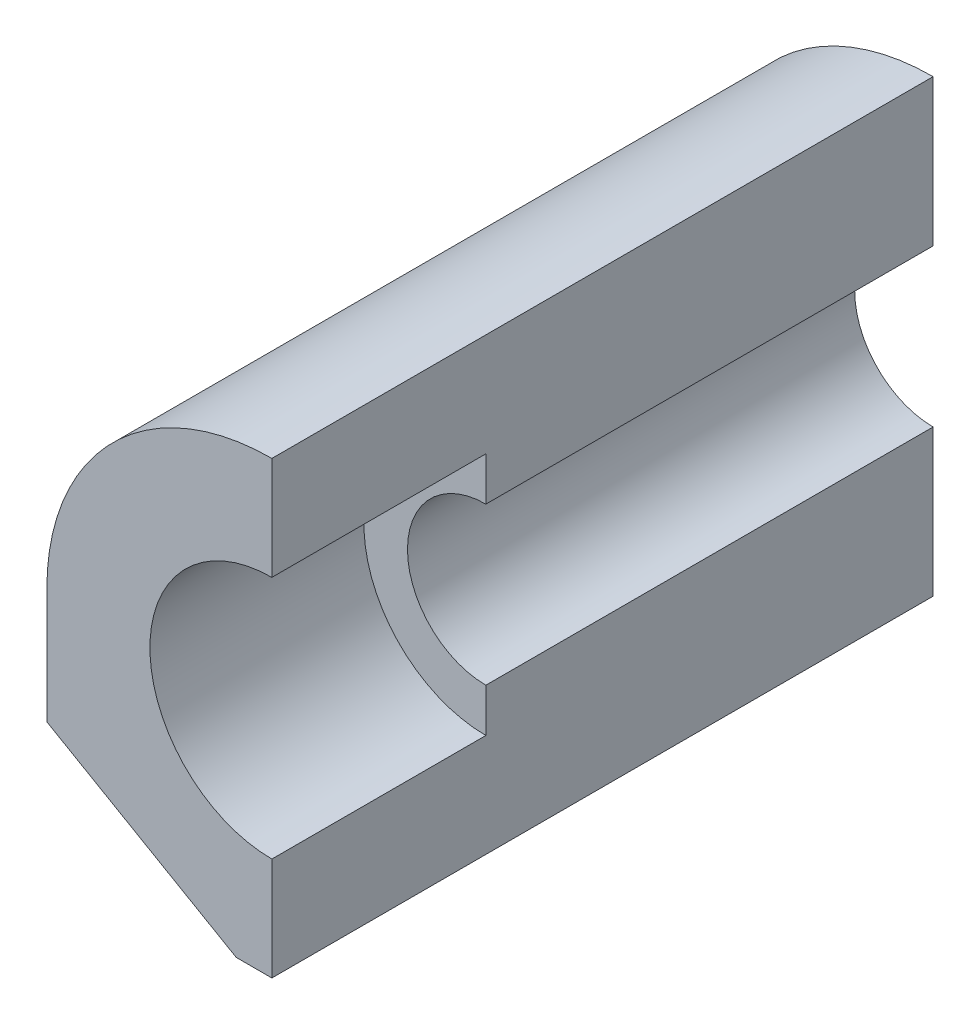
ISO-10303-21;
HEADER;
FILE_DESCRIPTION(('STEP AP214'),'2;1');
FILE_NAME('part.step','',(''),(''),'','','');
FILE_SCHEMA(('AUTOMOTIVE_DESIGN { 1 0 10303 214 1 1 1 1 }'));
ENDSEC;
DATA;
#1=APPLICATION_CONTEXT('core data for automotive mechanical design processes');
#2=APPLICATION_PROTOCOL_DEFINITION('international standard','automotive_design',2000,#1);
#3=PRODUCT_CONTEXT('',#1,'mechanical');
#4=PRODUCT('Part','Part','',(#3));
#5=PRODUCT_RELATED_PRODUCT_CATEGORY('part','',(#4));
#6=PRODUCT_DEFINITION_FORMATION('','',#4);
#7=PRODUCT_DEFINITION_CONTEXT('part definition',#1,'design');
#8=PRODUCT_DEFINITION('design','',#6,#7);
#9=PRODUCT_DEFINITION_SHAPE('','',#8);
#10=(LENGTH_UNIT() NAMED_UNIT(*) SI_UNIT(.MILLI.,.METRE.));
#11=(NAMED_UNIT(*) PLANE_ANGLE_UNIT() SI_UNIT($,.RADIAN.));
#12=(NAMED_UNIT(*) SI_UNIT($,.STERADIAN.) SOLID_ANGLE_UNIT());
#13=UNCERTAINTY_MEASURE_WITH_UNIT(LENGTH_MEASURE(1.E-05),#10,'distance_accuracy_value','');
#14=(GEOMETRIC_REPRESENTATION_CONTEXT(3) GLOBAL_UNCERTAINTY_ASSIGNED_CONTEXT((#13)) GLOBAL_UNIT_ASSIGNED_CONTEXT((#10,
#11,#12)) REPRESENTATION_CONTEXT('',''));
#15=CARTESIAN_POINT('',(0.,0.,0.));
#16=DIRECTION('',(0.,0.,1.));
#17=DIRECTION('',(1.,0.,0.));
#18=AXIS2_PLACEMENT_3D('',#15,#16,#17);
#19=CARTESIAN_POINT('',(0.,0.,-241.));
#20=DIRECTION('',(0.,0.,1.));
#21=DIRECTION('',(1.,0.,0.));
#22=AXIS2_PLACEMENT_3D('',#19,#20,#21);
#23=CYLINDRICAL_SURFACE('',#22,28.575);
#24=DIRECTION('',(0.,0.,1.));
#25=VECTOR('',#24,1.);
#26=CARTESIAN_POINT('',(0.,28.575,-241.));
#27=LINE('',#26,#25);
#28=CARTESIAN_POINT('',(0.,28.575,-241.));
#29=VERTEX_POINT('',#28);
#30=CARTESIAN_POINT('',(0.,28.575,-78.));
#31=VERTEX_POINT('',#30);
#32=EDGE_CURVE('E44',#29,#31,#27,.T.);
#33=ORIENTED_EDGE('',*,*,#32,.T.);
#34=CARTESIAN_POINT('',(0.,0.,-78.));
#35=DIRECTION('',(0.,0.,1.));
#36=DIRECTION('',(1.,0.,0.));
#37=AXIS2_PLACEMENT_3D('',#34,#35,#36);
#38=CIRCLE('',#37,28.575);
#39=CARTESIAN_POINT('',(0.,-28.575,-78.));
#40=VERTEX_POINT('',#39);
#41=EDGE_CURVE('E165',#31,#40,#38,.T.);
#42=ORIENTED_EDGE('',*,*,#41,.T.);
#43=DIRECTION('',(0.,0.,1.));
#44=VECTOR('',#43,1.);
#45=CARTESIAN_POINT('',(0.,-28.575,-241.));
#46=LINE('',#45,#44);
#47=CARTESIAN_POINT('',(0.,-28.575,-241.));
#48=VERTEX_POINT('',#47);
#49=EDGE_CURVE('E11',#48,#40,#46,.T.);
#50=ORIENTED_EDGE('',*,*,#49,.F.);
#51=CARTESIAN_POINT('',(0.,0.,-241.));
#52=DIRECTION('',(0.,0.,-1.));
#53=DIRECTION('',(1.,0.,0.));
#54=AXIS2_PLACEMENT_3D('',#51,#52,#53);
#55=CIRCLE('',#54,28.575);
#56=EDGE_CURVE('E153',#48,#29,#55,.T.);
#57=ORIENTED_EDGE('',*,*,#56,.T.);
#58=EDGE_LOOP('',(#33,#42,#50,#57));
#59=FACE_BOUND('',#58,.T.);
#60=ADVANCED_FACE('F41',(#59),#23,.F.);
#61=CARTESIAN_POINT('',(0.,-28.575,-241.));
#62=DIRECTION('',(1.,0.,0.));
#63=DIRECTION('',(0.,1.,0.));
#64=AXIS2_PLACEMENT_3D('',#61,#62,#63);
#65=PLANE('',#64);
#66=DIRECTION('',(0.,0.,1.));
#67=VECTOR('',#66,1.);
#68=CARTESIAN_POINT('',(0.,-44.45,-78.));
#69=LINE('',#68,#67);
#70=CARTESIAN_POINT('',(0.,-44.45,-78.));
#71=VERTEX_POINT('',#70);
#72=CARTESIAN_POINT('',(0.,-44.45,0.));
#73=VERTEX_POINT('',#72);
#74=EDGE_CURVE('E142',#71,#73,#69,.T.);
#75=ORIENTED_EDGE('',*,*,#74,.T.);
#76=DIRECTION('',(0.,1.,0.));
#77=VECTOR('',#76,1.);
#78=CARTESIAN_POINT('',(0.,-28.575,0.));
#79=LINE('',#78,#77);
#80=CARTESIAN_POINT('',(0.,-82.,0.));
#81=VERTEX_POINT('',#80);
#82=EDGE_CURVE('E151',#81,#73,#79,.T.);
#83=ORIENTED_EDGE('',*,*,#82,.F.);
#84=DIRECTION('',(0.,0.,1.));
#85=VECTOR('',#84,1.);
#86=CARTESIAN_POINT('',(0.,-82.,-241.));
#87=LINE('',#86,#85);
#88=CARTESIAN_POINT('',(0.,-82.,-241.));
#89=VERTEX_POINT('',#88);
#90=EDGE_CURVE('E49',#89,#81,#87,.T.);
#91=ORIENTED_EDGE('',*,*,#90,.F.);
#92=DIRECTION('',(0.,1.,0.));
#93=VECTOR('',#92,1.);
#94=CARTESIAN_POINT('',(0.,-28.575,-241.));
#95=LINE('',#94,#93);
#96=EDGE_CURVE('E129',#89,#48,#95,.T.);
#97=ORIENTED_EDGE('',*,*,#96,.T.);
#98=ORIENTED_EDGE('',*,*,#49,.T.);
#99=DIRECTION('',(0.,-1.,0.));
#100=VECTOR('',#99,1.);
#101=CARTESIAN_POINT('',(0.,-28.575,-78.));
#102=LINE('',#101,#100);
#103=EDGE_CURVE('E183',#40,#71,#102,.T.);
#104=ORIENTED_EDGE('',*,*,#103,.T.);
#105=EDGE_LOOP('',(#75,#83,#91,#97,#98,#104));
#106=FACE_BOUND('',#105,.T.);
#107=ADVANCED_FACE('F203',(#106),#65,.T.);
#108=CARTESIAN_POINT('',(0.,-82.,-241.));
#109=DIRECTION('',(0.,-1.,0.));
#110=DIRECTION('',(0.,0.,-1.));
#111=AXIS2_PLACEMENT_3D('',#108,#109,#110);
#112=PLANE('',#111);
#113=DIRECTION('',(1.,0.,0.));
#114=VECTOR('',#113,1.);
#115=CARTESIAN_POINT('',(0.,-82.,0.));
#116=LINE('',#115,#114);
#117=CARTESIAN_POINT('',(-13.,-82.,0.));
#118=VERTEX_POINT('',#117);
#119=EDGE_CURVE('E115',#118,#81,#116,.T.);
#120=ORIENTED_EDGE('',*,*,#119,.F.);
#121=DIRECTION('',(0.,0.,1.));
#122=VECTOR('',#121,1.);
#123=CARTESIAN_POINT('',(-13.,-82.,-241.));
#124=LINE('',#123,#122);
#125=CARTESIAN_POINT('',(-13.,-82.,-241.));
#126=VERTEX_POINT('',#125);
#127=EDGE_CURVE('E110',#126,#118,#124,.T.);
#128=ORIENTED_EDGE('',*,*,#127,.F.);
#129=DIRECTION('',(1.,0.,0.));
#130=VECTOR('',#129,1.);
#131=CARTESIAN_POINT('',(0.,-82.,-241.));
#132=LINE('',#131,#130);
#133=EDGE_CURVE('E113',#126,#89,#132,.T.);
#134=ORIENTED_EDGE('',*,*,#133,.T.);
#135=ORIENTED_EDGE('',*,*,#90,.T.);
#136=EDGE_LOOP('',(#120,#128,#134,#135));
#137=FACE_BOUND('',#136,.T.);
#138=ADVANCED_FACE('F112',(#137),#112,.T.);
#139=CARTESIAN_POINT('',(-13.,-82.,-241.));
#140=DIRECTION('',(-0.500000000000001,-0.866025403784438,0.));
#141=DIRECTION('',(0.866025403784438,-0.500000000000001,0.));
#142=AXIS2_PLACEMENT_3D('',#139,#140,#141);
#143=PLANE('',#142);
#144=DIRECTION('',(0.866025403784438,-0.500000000000001,0.));
#145=VECTOR('',#144,1.);
#146=CARTESIAN_POINT('',(-13.,-82.,0.));
#147=LINE('',#146,#145);
#148=CARTESIAN_POINT('',(-82.,-42.1628314259157,0.));
#149=VERTEX_POINT('',#148);
#150=EDGE_CURVE('E148',#149,#118,#147,.T.);
#151=ORIENTED_EDGE('',*,*,#150,.F.);
#152=DIRECTION('',(0.,0.,1.));
#153=VECTOR('',#152,1.);
#154=CARTESIAN_POINT('',(-82.,-42.1628314259157,-241.));
#155=LINE('',#154,#153);
#156=CARTESIAN_POINT('',(-82.,-42.1628314259157,-241.));
#157=VERTEX_POINT('',#156);
#158=EDGE_CURVE('E120',#157,#149,#155,.T.);
#159=ORIENTED_EDGE('',*,*,#158,.F.);
#160=DIRECTION('',(0.866025403784438,-0.500000000000001,0.));
#161=VECTOR('',#160,1.);
#162=CARTESIAN_POINT('',(-13.,-82.,-241.));
#163=LINE('',#162,#161);
#164=EDGE_CURVE('E126',#157,#126,#163,.T.);
#165=ORIENTED_EDGE('',*,*,#164,.T.);
#166=ORIENTED_EDGE('',*,*,#127,.T.);
#167=EDGE_LOOP('',(#151,#159,#165,#166));
#168=FACE_BOUND('',#167,.T.);
#169=ADVANCED_FACE('F131',(#168),#143,.T.);
#170=CARTESIAN_POINT('',(-82.,-42.1628314259157,-241.));
#171=DIRECTION('',(-1.,0.,0.));
#172=DIRECTION('',(0.,0.,1.));
#173=AXIS2_PLACEMENT_3D('',#170,#171,#172);
#174=PLANE('',#173);
#175=DIRECTION('',(0.,-1.,0.));
#176=VECTOR('',#175,1.);
#177=CARTESIAN_POINT('',(-82.,-42.1628314259157,0.));
#178=LINE('',#177,#176);
#179=CARTESIAN_POINT('',(-82.,0.,0.));
#180=VERTEX_POINT('',#179);
#181=EDGE_CURVE('E145',#180,#149,#178,.T.);
#182=ORIENTED_EDGE('',*,*,#181,.F.);
#183=DIRECTION('',(0.,0.,1.));
#184=VECTOR('',#183,1.);
#185=CARTESIAN_POINT('',(-82.,0.,-241.));
#186=LINE('',#185,#184);
#187=CARTESIAN_POINT('',(-82.,0.,-241.));
#188=VERTEX_POINT('',#187);
#189=EDGE_CURVE('E157',#188,#180,#186,.T.);
#190=ORIENTED_EDGE('',*,*,#189,.F.);
#191=DIRECTION('',(0.,-1.,0.));
#192=VECTOR('',#191,1.);
#193=CARTESIAN_POINT('',(-82.,-42.1628314259157,-241.));
#194=LINE('',#193,#192);
#195=EDGE_CURVE('E132',#188,#157,#194,.T.);
#196=ORIENTED_EDGE('',*,*,#195,.T.);
#197=ORIENTED_EDGE('',*,*,#158,.T.);
#198=EDGE_LOOP('',(#182,#190,#196,#197));
#199=FACE_BOUND('',#198,.T.);
#200=ADVANCED_FACE('F198',(#199),#174,.T.);
#201=CARTESIAN_POINT('',(0.,0.,-241.));
#202=DIRECTION('',(0.,0.,1.));
#203=DIRECTION('',(1.,0.,0.));
#204=AXIS2_PLACEMENT_3D('',#201,#202,#203);
#205=CYLINDRICAL_SURFACE('',#204,82.);
#206=CARTESIAN_POINT('',(0.,0.,0.));
#207=DIRECTION('',(0.,0.,1.));
#208=DIRECTION('',(-1.,0.,0.));
#209=AXIS2_PLACEMENT_3D('',#206,#207,#208);
#210=CIRCLE('',#209,82.);
#211=CARTESIAN_POINT('',(0.,82.,0.));
#212=VERTEX_POINT('',#211);
#213=EDGE_CURVE('E141',#212,#180,#210,.T.);
#214=ORIENTED_EDGE('',*,*,#213,.F.);
#215=DIRECTION('',(0.,0.,1.));
#216=VECTOR('',#215,1.);
#217=CARTESIAN_POINT('',(0.,82.,-241.));
#218=LINE('',#217,#216);
#219=CARTESIAN_POINT('',(0.,82.,-241.));
#220=VERTEX_POINT('',#219);
#221=EDGE_CURVE('E158',#220,#212,#218,.T.);
#222=ORIENTED_EDGE('',*,*,#221,.F.);
#223=CARTESIAN_POINT('',(0.,0.,-241.));
#224=DIRECTION('',(0.,0.,1.));
#225=DIRECTION('',(-1.,0.,0.));
#226=AXIS2_PLACEMENT_3D('',#223,#224,#225);
#227=CIRCLE('',#226,82.);
#228=EDGE_CURVE('E134',#220,#188,#227,.T.);
#229=ORIENTED_EDGE('',*,*,#228,.T.);
#230=ORIENTED_EDGE('',*,*,#189,.T.);
#231=EDGE_LOOP('',(#214,#222,#229,#230));
#232=FACE_BOUND('',#231,.T.);
#233=ADVANCED_FACE('F195',(#232),#205,.T.);
#234=CARTESIAN_POINT('',(0.,82.,-241.));
#235=DIRECTION('',(1.,0.,0.));
#236=DIRECTION('',(0.,1.,0.));
#237=AXIS2_PLACEMENT_3D('',#234,#235,#236);
#238=PLANE('',#237);
#239=DIRECTION('',(0.,0.,1.));
#240=VECTOR('',#239,1.);
#241=CARTESIAN_POINT('',(0.,44.45,-78.));
#242=LINE('',#241,#240);
#243=CARTESIAN_POINT('',(0.,44.45,-78.));
#244=VERTEX_POINT('',#243);
#245=CARTESIAN_POINT('',(0.,44.45,0.));
#246=VERTEX_POINT('',#245);
#247=EDGE_CURVE('E57',#244,#246,#242,.T.);
#248=ORIENTED_EDGE('',*,*,#247,.F.);
#249=DIRECTION('',(0.,-1.,0.));
#250=VECTOR('',#249,1.);
#251=CARTESIAN_POINT('',(0.,44.45,-78.));
#252=LINE('',#251,#250);
#253=EDGE_CURVE('E175',#244,#31,#252,.T.);
#254=ORIENTED_EDGE('',*,*,#253,.T.);
#255=ORIENTED_EDGE('',*,*,#32,.F.);
#256=DIRECTION('',(0.,1.,0.));
#257=VECTOR('',#256,1.);
#258=CARTESIAN_POINT('',(0.,82.,-241.));
#259=LINE('',#258,#257);
#260=EDGE_CURVE('E191',#29,#220,#259,.T.);
#261=ORIENTED_EDGE('',*,*,#260,.T.);
#262=ORIENTED_EDGE('',*,*,#221,.T.);
#263=DIRECTION('',(0.,1.,0.));
#264=VECTOR('',#263,1.);
#265=CARTESIAN_POINT('',(0.,82.,0.));
#266=LINE('',#265,#264);
#267=EDGE_CURVE('E139',#246,#212,#266,.T.);
#268=ORIENTED_EDGE('',*,*,#267,.F.);
#269=EDGE_LOOP('',(#248,#254,#255,#261,#262,#268));
#270=FACE_BOUND('',#269,.T.);
#271=ADVANCED_FACE('F185',(#270),#238,.T.);
#272=CARTESIAN_POINT('',(0.,0.,-241.));
#273=DIRECTION('',(0.,0.,1.));
#274=DIRECTION('',(1.,0.,0.));
#275=AXIS2_PLACEMENT_3D('',#272,#273,#274);
#276=PLANE('',#275);
#277=ORIENTED_EDGE('',*,*,#56,.F.);
#278=ORIENTED_EDGE('',*,*,#96,.F.);
#279=ORIENTED_EDGE('',*,*,#133,.F.);
#280=ORIENTED_EDGE('',*,*,#164,.F.);
#281=ORIENTED_EDGE('',*,*,#195,.F.);
#282=ORIENTED_EDGE('',*,*,#228,.F.);
#283=ORIENTED_EDGE('',*,*,#260,.F.);
#284=EDGE_LOOP('',(#277,#278,#279,#280,#281,#282,#283));
#285=FACE_BOUND('',#284,.T.);
#286=ADVANCED_FACE('F124',(#285),#276,.F.);
#287=CARTESIAN_POINT('',(0.,0.,0.));
#288=DIRECTION('',(0.,0.,1.));
#289=DIRECTION('',(1.,0.,0.));
#290=AXIS2_PLACEMENT_3D('',#287,#288,#289);
#291=PLANE('',#290);
#292=CARTESIAN_POINT('',(0.,0.,0.));
#293=DIRECTION('',(0.,0.,1.));
#294=DIRECTION('',(1.,0.,0.));
#295=AXIS2_PLACEMENT_3D('',#292,#293,#294);
#296=CIRCLE('',#295,44.45);
#297=EDGE_CURVE('E179',#246,#73,#296,.T.);
#298=ORIENTED_EDGE('',*,*,#297,.F.);
#299=ORIENTED_EDGE('',*,*,#267,.T.);
#300=ORIENTED_EDGE('',*,*,#213,.T.);
#301=ORIENTED_EDGE('',*,*,#181,.T.);
#302=ORIENTED_EDGE('',*,*,#150,.T.);
#303=ORIENTED_EDGE('',*,*,#119,.T.);
#304=ORIENTED_EDGE('',*,*,#82,.T.);
#305=EDGE_LOOP('',(#298,#299,#300,#301,#302,#303,#304));
#306=FACE_BOUND('',#305,.T.);
#307=ADVANCED_FACE('F200',(#306),#291,.T.);
#308=CARTESIAN_POINT('',(0.,0.,-78.));
#309=DIRECTION('',(0.,0.,1.));
#310=DIRECTION('',(1.,0.,0.));
#311=AXIS2_PLACEMENT_3D('',#308,#309,#310);
#312=CYLINDRICAL_SURFACE('',#311,44.45);
#313=ORIENTED_EDGE('',*,*,#297,.T.);
#314=ORIENTED_EDGE('',*,*,#74,.F.);
#315=CARTESIAN_POINT('',(0.,0.,-78.));
#316=DIRECTION('',(0.,0.,1.));
#317=DIRECTION('',(1.,0.,0.));
#318=AXIS2_PLACEMENT_3D('',#315,#316,#317);
#319=CIRCLE('',#318,44.45);
#320=EDGE_CURVE('E177',#244,#71,#319,.T.);
#321=ORIENTED_EDGE('',*,*,#320,.F.);
#322=ORIENTED_EDGE('',*,*,#247,.T.);
#323=EDGE_LOOP('',(#313,#314,#321,#322));
#324=FACE_BOUND('',#323,.T.);
#325=ADVANCED_FACE('F181',(#324),#312,.F.);
#326=CARTESIAN_POINT('',(0.,0.,-78.));
#327=DIRECTION('',(0.,0.,1.));
#328=DIRECTION('',(1.,0.,0.));
#329=AXIS2_PLACEMENT_3D('',#326,#327,#328);
#330=PLANE('',#329);
#331=ORIENTED_EDGE('',*,*,#253,.F.);
#332=ORIENTED_EDGE('',*,*,#320,.T.);
#333=ORIENTED_EDGE('',*,*,#103,.F.);
#334=ORIENTED_EDGE('',*,*,#41,.F.);
#335=EDGE_LOOP('',(#331,#332,#333,#334));
#336=FACE_BOUND('',#335,.T.);
#337=ADVANCED_FACE('F176',(#336),#330,.T.);
#338=CLOSED_SHELL('',(#60,#107,#138,#169,#200,#233,#271,#286,#307,#325,#337));
#339=MANIFOLD_SOLID_BREP('B2',#338);
#340=ADVANCED_BREP_SHAPE_REPRESENTATION('',(#18,#339),#14);
#341=SHAPE_DEFINITION_REPRESENTATION(#9,#340);
ENDSEC;
END-ISO-10303-21;
